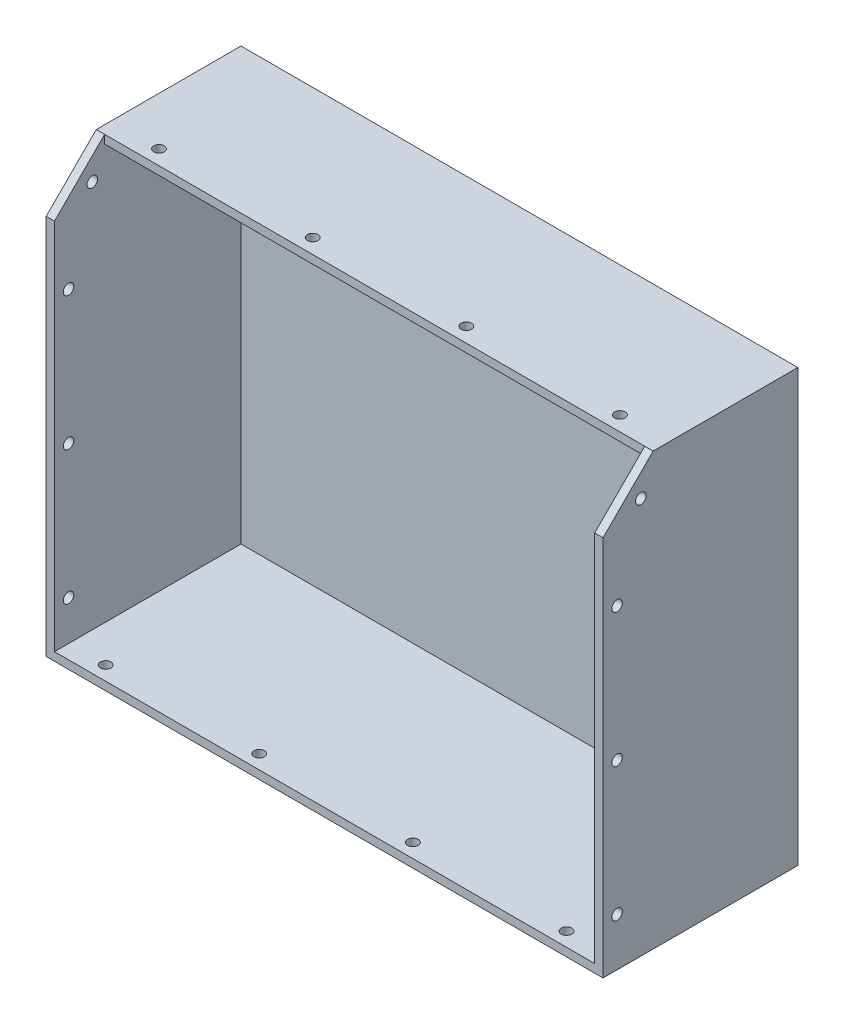
ISO-10303-21;
HEADER;
FILE_DESCRIPTION(('STEP AP214'),'2;1');
FILE_NAME('part.step','',(''),(''),'','','');
FILE_SCHEMA(('AUTOMOTIVE_DESIGN { 1 0 10303 214 1 1 1 1 }'));
ENDSEC;
DATA;
#1=APPLICATION_CONTEXT('core data for automotive mechanical design processes');
#2=APPLICATION_PROTOCOL_DEFINITION('international standard','automotive_design',2000,#1);
#3=PRODUCT_CONTEXT('',#1,'mechanical');
#4=PRODUCT('Part','Part','',(#3));
#5=PRODUCT_RELATED_PRODUCT_CATEGORY('part','',(#4));
#6=PRODUCT_DEFINITION_FORMATION('','',#4);
#7=PRODUCT_DEFINITION_CONTEXT('part definition',#1,'design');
#8=PRODUCT_DEFINITION('design','',#6,#7);
#9=PRODUCT_DEFINITION_SHAPE('','',#8);
#10=(LENGTH_UNIT() NAMED_UNIT(*) SI_UNIT(.MILLI.,.METRE.));
#11=(NAMED_UNIT(*) PLANE_ANGLE_UNIT() SI_UNIT($,.RADIAN.));
#12=(NAMED_UNIT(*) SI_UNIT($,.STERADIAN.) SOLID_ANGLE_UNIT());
#13=UNCERTAINTY_MEASURE_WITH_UNIT(LENGTH_MEASURE(1.E-05),#10,'distance_accuracy_value','');
#14=(GEOMETRIC_REPRESENTATION_CONTEXT(3) GLOBAL_UNCERTAINTY_ASSIGNED_CONTEXT((#13)) GLOBAL_UNIT_ASSIGNED_CONTEXT((#10,
#11,#12)) REPRESENTATION_CONTEXT('',''));
#15=CARTESIAN_POINT('',(0.,0.,0.));
#16=DIRECTION('',(0.,0.,1.));
#17=DIRECTION('',(1.,0.,0.));
#18=AXIS2_PLACEMENT_3D('',#15,#16,#17);
#19=CARTESIAN_POINT('',(87.6723333333333,-82.001,49.4453333333334));
#20=DIRECTION('',(0.,1.,0.));
#21=DIRECTION('',(0.,0.,1.));
#22=AXIS2_PLACEMENT_3D('',#19,#20,#21);
#23=CYLINDRICAL_SURFACE('',#22,2.);
#24=CARTESIAN_POINT('',(87.6723333333333,78.825,49.4453333333334));
#25=DIRECTION('',(0.,-1.,0.));
#26=DIRECTION('',(0.,0.,-1.));
#27=AXIS2_PLACEMENT_3D('',#24,#25,#26);
#28=CIRCLE('',#27,2.);
#29=CARTESIAN_POINT('',(87.6723333333333,78.825,47.4453333333334));
#30=VERTEX_POINT('',#29);
#31=EDGE_CURVE('E51',#30,#30,#28,.F.);
#32=ORIENTED_EDGE('',*,*,#31,.F.);
#33=EDGE_LOOP('',(#32));
#34=FACE_BOUND('',#33,.T.);
#35=CARTESIAN_POINT('',(87.6723333333333,82.,49.4453333333334));
#36=DIRECTION('',(0.,1.,0.));
#37=DIRECTION('',(0.,0.,1.));
#38=AXIS2_PLACEMENT_3D('',#35,#36,#37);
#39=CIRCLE('',#38,2.);
#40=CARTESIAN_POINT('',(87.6723333333333,82.,51.4453333333334));
#41=VERTEX_POINT('',#40);
#42=EDGE_CURVE('E11',#41,#41,#39,.T.);
#43=ORIENTED_EDGE('',*,*,#42,.T.);
#44=EDGE_LOOP('',(#43));
#45=FACE_BOUND('',#44,.T.);
#46=ADVANCED_FACE('F42',(#34,#45),#23,.F.);
#47=CARTESIAN_POINT('',(29.2523333333333,-82.001,49.4453333333334));
#48=DIRECTION('',(0.,1.,0.));
#49=DIRECTION('',(0.,0.,1.));
#50=AXIS2_PLACEMENT_3D('',#47,#48,#49);
#51=CYLINDRICAL_SURFACE('',#50,2.);
#52=CARTESIAN_POINT('',(29.2523333333333,78.825,49.4453333333334));
#53=DIRECTION('',(0.,-1.,0.));
#54=DIRECTION('',(0.,0.,-1.));
#55=AXIS2_PLACEMENT_3D('',#52,#53,#54);
#56=CIRCLE('',#55,2.);
#57=CARTESIAN_POINT('',(29.2523333333333,78.825,47.4453333333334));
#58=VERTEX_POINT('',#57);
#59=EDGE_CURVE('E174',#58,#58,#56,.F.);
#60=ORIENTED_EDGE('',*,*,#59,.F.);
#61=EDGE_LOOP('',(#60));
#62=FACE_BOUND('',#61,.T.);
#63=CARTESIAN_POINT('',(29.2523333333333,82.,49.4453333333334));
#64=DIRECTION('',(0.,1.,0.));
#65=DIRECTION('',(0.,0.,1.));
#66=AXIS2_PLACEMENT_3D('',#63,#64,#65);
#67=CIRCLE('',#66,2.);
#68=CARTESIAN_POINT('',(29.2523333333333,82.,51.4453333333334));
#69=VERTEX_POINT('',#68);
#70=EDGE_CURVE('E178',#69,#69,#67,.T.);
#71=ORIENTED_EDGE('',*,*,#70,.T.);
#72=EDGE_LOOP('',(#71));
#73=FACE_BOUND('',#72,.T.);
#74=ADVANCED_FACE('F190',(#62,#73),#51,.F.);
#75=CARTESIAN_POINT('',(86.6563333333333,82.001,68.7493333333333));
#76=DIRECTION('',(0.,-1.,0.));
#77=DIRECTION('',(0.,0.,-1.));
#78=AXIS2_PLACEMENT_3D('',#75,#76,#77);
#79=CYLINDRICAL_SURFACE('',#78,2.);
#80=CARTESIAN_POINT('',(86.6563333333333,-78.825,68.7493333333333));
#81=DIRECTION('',(0.,1.,0.));
#82=DIRECTION('',(0.,0.,1.));
#83=AXIS2_PLACEMENT_3D('',#80,#81,#82);
#84=CIRCLE('',#83,2.);
#85=CARTESIAN_POINT('',(86.6563333333333,-78.825,70.7493333333333));
#86=VERTEX_POINT('',#85);
#87=EDGE_CURVE('E166',#86,#86,#84,.F.);
#88=ORIENTED_EDGE('',*,*,#87,.F.);
#89=EDGE_LOOP('',(#88));
#90=FACE_BOUND('',#89,.T.);
#91=CARTESIAN_POINT('',(86.6563333333333,-82.,68.7493333333333));
#92=DIRECTION('',(0.,-1.,0.));
#93=DIRECTION('',(0.,0.,-1.));
#94=AXIS2_PLACEMENT_3D('',#91,#92,#93);
#95=CIRCLE('',#94,2.);
#96=CARTESIAN_POINT('',(86.6563333333333,-82.,66.7493333333333));
#97=VERTEX_POINT('',#96);
#98=EDGE_CURVE('E170',#97,#97,#95,.T.);
#99=ORIENTED_EDGE('',*,*,#98,.T.);
#100=EDGE_LOOP('',(#99));
#101=FACE_BOUND('',#100,.T.);
#102=ADVANCED_FACE('F223',(#90,#101),#79,.F.);
#103=CARTESIAN_POINT('',(28.2363333333333,82.001,68.7493333333333));
#104=DIRECTION('',(0.,-1.,0.));
#105=DIRECTION('',(0.,0.,-1.));
#106=AXIS2_PLACEMENT_3D('',#103,#104,#105);
#107=CYLINDRICAL_SURFACE('',#106,2.);
#108=CARTESIAN_POINT('',(28.2363333333333,-78.825,68.7493333333333));
#109=DIRECTION('',(0.,1.,0.));
#110=DIRECTION('',(0.,0.,1.));
#111=AXIS2_PLACEMENT_3D('',#108,#109,#110);
#112=CIRCLE('',#111,2.);
#113=CARTESIAN_POINT('',(28.2363333333333,-78.825,70.7493333333333));
#114=VERTEX_POINT('',#113);
#115=EDGE_CURVE('E158',#114,#114,#112,.F.);
#116=ORIENTED_EDGE('',*,*,#115,.F.);
#117=EDGE_LOOP('',(#116));
#118=FACE_BOUND('',#117,.T.);
#119=CARTESIAN_POINT('',(28.2363333333333,-82.,68.7493333333333));
#120=DIRECTION('',(0.,-1.,0.));
#121=DIRECTION('',(0.,0.,-1.));
#122=AXIS2_PLACEMENT_3D('',#119,#120,#121);
#123=CIRCLE('',#122,2.);
#124=CARTESIAN_POINT('',(28.2363333333333,-82.,66.7493333333333));
#125=VERTEX_POINT('',#124);
#126=EDGE_CURVE('E162',#125,#125,#123,.T.);
#127=ORIENTED_EDGE('',*,*,#126,.T.);
#128=EDGE_LOOP('',(#127));
#129=FACE_BOUND('',#128,.T.);
#130=ADVANCED_FACE('F219',(#118,#129),#107,.F.);
#131=CARTESIAN_POINT('',(105.875666666667,37.888,68.7493333333333));
#132=DIRECTION('',(-1.,0.,0.));
#133=DIRECTION('',(0.,0.,1.));
#134=AXIS2_PLACEMENT_3D('',#131,#132,#133);
#135=CYLINDRICAL_SURFACE('',#134,2.);
#136=CARTESIAN_POINT('',(-102.700666666667,37.888,68.7493333333333));
#137=DIRECTION('',(1.,0.,0.));
#138=DIRECTION('',(0.,0.,-1.));
#139=AXIS2_PLACEMENT_3D('',#136,#137,#138);
#140=CIRCLE('',#139,2.);
#141=CARTESIAN_POINT('',(-102.700666666667,37.888,66.7493333333333));
#142=VERTEX_POINT('',#141);
#143=EDGE_CURVE('E150',#142,#142,#140,.T.);
#144=ORIENTED_EDGE('',*,*,#143,.T.);
#145=EDGE_LOOP('',(#144));
#146=FACE_BOUND('',#145,.T.);
#147=CARTESIAN_POINT('',(-105.875666666667,37.888,68.7493333333333));
#148=DIRECTION('',(-1.,0.,0.));
#149=DIRECTION('',(0.,0.,1.));
#150=AXIS2_PLACEMENT_3D('',#147,#148,#149);
#151=CIRCLE('',#150,2.);
#152=CARTESIAN_POINT('',(-105.875666666667,37.888,70.7493333333333));
#153=VERTEX_POINT('',#152);
#154=EDGE_CURVE('E154',#153,#153,#151,.T.);
#155=ORIENTED_EDGE('',*,*,#154,.T.);
#156=EDGE_LOOP('',(#155));
#157=FACE_BOUND('',#156,.T.);
#158=ADVANCED_FACE('F205',(#146,#157),#135,.F.);
#159=CARTESIAN_POINT('',(105.875666666667,37.888,68.7493333333333));
#160=DIRECTION('',(-1.,0.,0.));
#161=DIRECTION('',(0.,0.,1.));
#162=AXIS2_PLACEMENT_3D('',#159,#160,#161);
#163=CYLINDRICAL_SURFACE('',#162,2.);
#164=CARTESIAN_POINT('',(105.875666666667,37.888,68.7493333333333));
#165=DIRECTION('',(-1.,0.,0.));
#166=DIRECTION('',(0.,0.,1.));
#167=AXIS2_PLACEMENT_3D('',#164,#165,#166);
#168=CIRCLE('',#167,2.);
#169=CARTESIAN_POINT('',(105.875666666667,37.888,70.7493333333333));
#170=VERTEX_POINT('',#169);
#171=EDGE_CURVE('E136',#170,#170,#168,.T.);
#172=ORIENTED_EDGE('',*,*,#171,.F.);
#173=EDGE_LOOP('',(#172));
#174=FACE_BOUND('',#173,.T.);
#175=CARTESIAN_POINT('',(102.700666666667,37.888,68.7493333333333));
#176=DIRECTION('',(1.,0.,0.));
#177=DIRECTION('',(0.,0.,-1.));
#178=AXIS2_PLACEMENT_3D('',#175,#176,#177);
#179=CIRCLE('',#178,2.);
#180=CARTESIAN_POINT('',(102.700666666667,37.888,66.7493333333333));
#181=VERTEX_POINT('',#180);
#182=EDGE_CURVE('E146',#181,#181,#179,.T.);
#183=ORIENTED_EDGE('',*,*,#182,.F.);
#184=EDGE_LOOP('',(#183));
#185=FACE_BOUND('',#184,.T.);
#186=ADVANCED_FACE('F196',(#174,#185),#163,.F.);
#187=CARTESIAN_POINT('',(-105.875666666667,82.,74.0833333333333));
#188=DIRECTION('',(0.,-1.,0.));
#189=DIRECTION('',(0.,0.,-1.));
#190=AXIS2_PLACEMENT_3D('',#187,#188,#189);
#191=PLANE('',#190);
#192=CARTESIAN_POINT('',(-29.1676666666667,82.,49.4453333333333));
#193=DIRECTION('',(0.,1.,0.));
#194=DIRECTION('',(0.,0.,1.));
#195=AXIS2_PLACEMENT_3D('',#192,#193,#194);
#196=CIRCLE('',#195,2.);
#197=CARTESIAN_POINT('',(-29.1676666666667,82.,51.4453333333333));
#198=VERTEX_POINT('',#197);
#199=EDGE_CURVE('E530',#198,#198,#196,.T.);
#200=ORIENTED_EDGE('',*,*,#199,.F.);
#201=EDGE_LOOP('',(#200));
#202=FACE_BOUND('',#201,.T.);
#203=CARTESIAN_POINT('',(-87.5876666666667,82.,49.4453333333333));
#204=DIRECTION('',(0.,1.,0.));
#205=DIRECTION('',(0.,0.,1.));
#206=AXIS2_PLACEMENT_3D('',#203,#204,#205);
#207=CIRCLE('',#206,2.);
#208=CARTESIAN_POINT('',(-87.5876666666667,82.,51.4453333333333));
#209=VERTEX_POINT('',#208);
#210=EDGE_CURVE('E538',#209,#209,#207,.T.);
#211=ORIENTED_EDGE('',*,*,#210,.F.);
#212=EDGE_LOOP('',(#211));
#213=FACE_BOUND('',#212,.T.);
#214=DIRECTION('',(-1.,0.,0.));
#215=VECTOR('',#214,1.);
#216=CARTESIAN_POINT('',(457.207176090762,82.,55.0333333333333));
#217=LINE('',#216,#215);
#218=CARTESIAN_POINT('',(105.875666666667,82.,55.0333333333333));
#219=VERTEX_POINT('',#218);
#220=CARTESIAN_POINT('',(102.700666666667,82.,55.0333333333333));
#221=VERTEX_POINT('',#220);
#222=EDGE_CURVE('E299',#219,#221,#217,.T.);
#223=ORIENTED_EDGE('',*,*,#222,.F.);
#224=DIRECTION('',(0.,0.,-1.));
#225=VECTOR('',#224,1.);
#226=CARTESIAN_POINT('',(105.875666666667,82.,74.0833333333333));
#227=LINE('',#226,#225);
#228=CARTESIAN_POINT('',(105.875666666667,82.,0.));
#229=VERTEX_POINT('',#228);
#230=EDGE_CURVE('E133',#219,#229,#227,.T.);
#231=ORIENTED_EDGE('',*,*,#230,.T.);
#232=DIRECTION('',(-1.,0.,0.));
#233=VECTOR('',#232,1.);
#234=CARTESIAN_POINT('',(-105.875666666667,82.,0.));
#235=LINE('',#234,#233);
#236=CARTESIAN_POINT('',(-105.875666666667,82.,0.));
#237=VERTEX_POINT('',#236);
#238=EDGE_CURVE('E113',#229,#237,#235,.T.);
#239=ORIENTED_EDGE('',*,*,#238,.T.);
#240=DIRECTION('',(0.,0.,-1.));
#241=VECTOR('',#240,1.);
#242=CARTESIAN_POINT('',(-105.875666666667,82.,74.0833333333333));
#243=LINE('',#242,#241);
#244=CARTESIAN_POINT('',(-105.875666666667,82.,55.0333333333333));
#245=VERTEX_POINT('',#244);
#246=EDGE_CURVE('E130',#245,#237,#243,.T.);
#247=ORIENTED_EDGE('',*,*,#246,.F.);
#248=DIRECTION('',(-1.,0.,0.));
#249=VECTOR('',#248,1.);
#250=CARTESIAN_POINT('',(-102.700666666667,82.,55.0333333333333));
#251=LINE('',#250,#249);
#252=CARTESIAN_POINT('',(-102.700666666667,82.,55.0333333333333));
#253=VERTEX_POINT('',#252);
#254=EDGE_CURVE('E319',#253,#245,#251,.T.);
#255=ORIENTED_EDGE('',*,*,#254,.F.);
#256=DIRECTION('',(-1.,0.,0.));
#257=VECTOR('',#256,1.);
#258=CARTESIAN_POINT('',(-102.700666666667,82.,55.0333333333333));
#259=LINE('',#258,#257);
#260=EDGE_CURVE('E315',#221,#253,#259,.T.);
#261=ORIENTED_EDGE('',*,*,#260,.F.);
#262=EDGE_LOOP('',(#223,#231,#239,#247,#255,#261));
#263=FACE_BOUND('',#262,.T.);
#264=ORIENTED_EDGE('',*,*,#70,.F.);
#265=EDGE_LOOP('',(#264));
#266=FACE_BOUND('',#265,.T.);
#267=ORIENTED_EDGE('',*,*,#42,.F.);
#268=EDGE_LOOP('',(#267));
#269=FACE_BOUND('',#268,.T.);
#270=ADVANCED_FACE('F193',(#202,#213,#263,#266,#269),#191,.F.);
#271=CARTESIAN_POINT('',(102.700666666667,0.,3.17500000333333));
#272=DIRECTION('',(1.,0.,0.));
#273=DIRECTION('',(0.,0.,-1.));
#274=AXIS2_PLACEMENT_3D('',#271,#272,#273);
#275=PLANE('',#274);
#276=CARTESIAN_POINT('',(102.700666666667,68.7092209408177,59.7030665162892));
#277=DIRECTION('',(1.,0.,0.));
#278=DIRECTION('',(0.,0.,-1.));
#279=AXIS2_PLACEMENT_3D('',#276,#277,#278);
#280=CIRCLE('',#279,1.99999999999998);
#281=CARTESIAN_POINT('',(102.700666666667,68.7092209408177,57.7030665162893));
#282=VERTEX_POINT('',#281);
#283=EDGE_CURVE('E523',#282,#282,#280,.T.);
#284=ORIENTED_EDGE('',*,*,#283,.T.);
#285=EDGE_LOOP('',(#284));
#286=FACE_BOUND('',#285,.T.);
#287=CARTESIAN_POINT('',(102.700666666667,-12.912,68.7493333333333));
#288=DIRECTION('',(1.,0.,0.));
#289=DIRECTION('',(0.,0.,-1.));
#290=AXIS2_PLACEMENT_3D('',#287,#288,#289);
#291=CIRCLE('',#290,2.);
#292=CARTESIAN_POINT('',(102.700666666667,-12.912,66.7493333333333));
#293=VERTEX_POINT('',#292);
#294=EDGE_CURVE('E285',#293,#293,#291,.T.);
#295=ORIENTED_EDGE('',*,*,#294,.T.);
#296=EDGE_LOOP('',(#295));
#297=FACE_BOUND('',#296,.T.);
#298=CARTESIAN_POINT('',(102.700666666667,-63.712,68.7493333333333));
#299=DIRECTION('',(1.,0.,0.));
#300=DIRECTION('',(0.,0.,-1.));
#301=AXIS2_PLACEMENT_3D('',#298,#299,#300);
#302=CIRCLE('',#301,2.);
#303=CARTESIAN_POINT('',(102.700666666667,-63.712,66.7493333333333));
#304=VERTEX_POINT('',#303);
#305=EDGE_CURVE('E141',#304,#304,#302,.T.);
#306=ORIENTED_EDGE('',*,*,#305,.T.);
#307=EDGE_LOOP('',(#306));
#308=FACE_BOUND('',#307,.T.);
#309=DIRECTION('',(0.,-0.707106781186547,0.707106781186548));
#310=VECTOR('',#309,1.);
#311=CARTESIAN_POINT('',(102.700666666667,68.5166666666667,68.5166666666667));
#312=LINE('',#311,#310);
#313=CARTESIAN_POINT('',(102.700666666667,62.95,74.0833333333333));
#314=VERTEX_POINT('',#313);
#315=EDGE_CURVE('E332',#221,#314,#312,.T.);
#316=ORIENTED_EDGE('',*,*,#315,.F.);
#317=DIRECTION('',(0.,1.,0.));
#318=VECTOR('',#317,1.);
#319=CARTESIAN_POINT('',(102.700666666667,82.,55.0333333333333));
#320=LINE('',#319,#318);
#321=CARTESIAN_POINT('',(102.700666666667,78.825,55.0333333333333));
#322=VERTEX_POINT('',#321);
#323=EDGE_CURVE('E311',#322,#221,#320,.T.);
#324=ORIENTED_EDGE('',*,*,#323,.F.);
#325=DIRECTION('',(0.,0.,1.));
#326=VECTOR('',#325,1.);
#327=CARTESIAN_POINT('',(102.700666666667,78.825,3.17500000333333));
#328=LINE('',#327,#326);
#329=CARTESIAN_POINT('',(102.700666666667,78.825,3.17500000333333));
#330=VERTEX_POINT('',#329);
#331=EDGE_CURVE('E115',#330,#322,#328,.T.);
#332=ORIENTED_EDGE('',*,*,#331,.F.);
#333=DIRECTION('',(0.,1.,0.));
#334=VECTOR('',#333,1.);
#335=CARTESIAN_POINT('',(102.700666666667,0.,3.17500000333333));
#336=LINE('',#335,#334);
#337=CARTESIAN_POINT('',(102.700666666667,-78.825,3.17500000333333));
#338=VERTEX_POINT('',#337);
#339=EDGE_CURVE('E354',#338,#330,#336,.T.);
#340=ORIENTED_EDGE('',*,*,#339,.F.);
#341=DIRECTION('',(0.,0.,1.));
#342=VECTOR('',#341,1.);
#343=CARTESIAN_POINT('',(102.700666666667,-78.825,3.17500000333333));
#344=LINE('',#343,#342);
#345=CARTESIAN_POINT('',(102.700666666667,-78.825,74.0833333333333));
#346=VERTEX_POINT('',#345);
#347=EDGE_CURVE('E121',#338,#346,#344,.T.);
#348=ORIENTED_EDGE('',*,*,#347,.T.);
#349=DIRECTION('',(0.,1.,0.));
#350=VECTOR('',#349,1.);
#351=CARTESIAN_POINT('',(102.700666666667,0.,74.0833333333333));
#352=LINE('',#351,#350);
#353=EDGE_CURVE('E346',#346,#314,#352,.T.);
#354=ORIENTED_EDGE('',*,*,#353,.T.);
#355=EDGE_LOOP('',(#316,#324,#332,#340,#348,#354));
#356=FACE_BOUND('',#355,.T.);
#357=ORIENTED_EDGE('',*,*,#182,.T.);
#358=EDGE_LOOP('',(#357));
#359=FACE_BOUND('',#358,.T.);
#360=ADVANCED_FACE('F195',(#286,#297,#308,#356,#359),#275,.F.);
#361=CARTESIAN_POINT('',(0.,78.825,3.17500000333333));
#362=DIRECTION('',(0.,-1.,0.));
#363=DIRECTION('',(0.,0.,-1.));
#364=AXIS2_PLACEMENT_3D('',#361,#362,#363);
#365=PLANE('',#364);
#366=CARTESIAN_POINT('',(-29.1676666666667,78.825,49.4453333333333));
#367=DIRECTION('',(0.,-1.,0.));
#368=DIRECTION('',(0.,0.,-1.));
#369=AXIS2_PLACEMENT_3D('',#366,#367,#368);
#370=CIRCLE('',#369,2.);
#371=CARTESIAN_POINT('',(-29.1676666666667,78.825,47.4453333333334));
#372=VERTEX_POINT('',#371);
#373=EDGE_CURVE('E527',#372,#372,#370,.F.);
#374=ORIENTED_EDGE('',*,*,#373,.T.);
#375=EDGE_LOOP('',(#374));
#376=FACE_BOUND('',#375,.T.);
#377=CARTESIAN_POINT('',(-87.5876666666667,78.825,49.4453333333333));
#378=DIRECTION('',(0.,-1.,0.));
#379=DIRECTION('',(0.,0.,-1.));
#380=AXIS2_PLACEMENT_3D('',#377,#378,#379);
#381=CIRCLE('',#380,2.);
#382=CARTESIAN_POINT('',(-87.5876666666667,78.825,47.4453333333333));
#383=VERTEX_POINT('',#382);
#384=EDGE_CURVE('E534',#383,#383,#381,.F.);
#385=ORIENTED_EDGE('',*,*,#384,.T.);
#386=EDGE_LOOP('',(#385));
#387=FACE_BOUND('',#386,.T.);
#388=ORIENTED_EDGE('',*,*,#331,.T.);
#389=DIRECTION('',(1.,0.,0.));
#390=VECTOR('',#389,1.);
#391=CARTESIAN_POINT('',(-102.700666666667,78.825,55.0333333333333));
#392=LINE('',#391,#390);
#393=CARTESIAN_POINT('',(-102.700666666667,78.825,55.0333333333333));
#394=VERTEX_POINT('',#393);
#395=EDGE_CURVE('E307',#394,#322,#392,.T.);
#396=ORIENTED_EDGE('',*,*,#395,.F.);
#397=DIRECTION('',(0.,0.,1.));
#398=VECTOR('',#397,1.);
#399=CARTESIAN_POINT('',(-102.700666666667,78.825,3.17500000333333));
#400=LINE('',#399,#398);
#401=CARTESIAN_POINT('',(-102.700666666667,78.825,3.17500000333333));
#402=VERTEX_POINT('',#401);
#403=EDGE_CURVE('E358',#402,#394,#400,.T.);
#404=ORIENTED_EDGE('',*,*,#403,.F.);
#405=DIRECTION('',(1.,0.,0.));
#406=VECTOR('',#405,1.);
#407=CARTESIAN_POINT('',(0.,78.825,3.17500000333333));
#408=LINE('',#407,#406);
#409=EDGE_CURVE('E341',#402,#330,#408,.T.);
#410=ORIENTED_EDGE('',*,*,#409,.T.);
#411=EDGE_LOOP('',(#388,#396,#404,#410));
#412=FACE_BOUND('',#411,.T.);
#413=ORIENTED_EDGE('',*,*,#59,.T.);
#414=EDGE_LOOP('',(#413));
#415=FACE_BOUND('',#414,.T.);
#416=ORIENTED_EDGE('',*,*,#31,.T.);
#417=EDGE_LOOP('',(#416));
#418=FACE_BOUND('',#417,.T.);
#419=ADVANCED_FACE('F186',(#376,#387,#412,#415,#418),#365,.T.);
#420=CARTESIAN_POINT('',(105.875666666667,-82.,74.0833333333333));
#421=DIRECTION('',(-1.,0.,0.));
#422=DIRECTION('',(0.,0.,1.));
#423=AXIS2_PLACEMENT_3D('',#420,#421,#422);
#424=PLANE('',#423);
#425=CARTESIAN_POINT('',(105.875666666667,68.7092209408177,59.7030665162892));
#426=DIRECTION('',(-1.,0.,0.));
#427=DIRECTION('',(0.,0.,1.));
#428=AXIS2_PLACEMENT_3D('',#425,#426,#427);
#429=CIRCLE('',#428,1.99999999999998);
#430=CARTESIAN_POINT('',(105.875666666667,68.7092209408177,61.7030665162892));
#431=VERTEX_POINT('',#430);
#432=EDGE_CURVE('E517',#431,#431,#429,.T.);
#433=ORIENTED_EDGE('',*,*,#432,.T.);
#434=EDGE_LOOP('',(#433));
#435=FACE_BOUND('',#434,.T.);
#436=CARTESIAN_POINT('',(105.875666666667,-12.912,68.7493333333333));
#437=DIRECTION('',(-1.,0.,0.));
#438=DIRECTION('',(0.,0.,1.));
#439=AXIS2_PLACEMENT_3D('',#436,#437,#438);
#440=CIRCLE('',#439,2.);
#441=CARTESIAN_POINT('',(105.875666666667,-12.912,70.7493333333333));
#442=VERTEX_POINT('',#441);
#443=EDGE_CURVE('E281',#442,#442,#440,.T.);
#444=ORIENTED_EDGE('',*,*,#443,.T.);
#445=EDGE_LOOP('',(#444));
#446=FACE_BOUND('',#445,.T.);
#447=CARTESIAN_POINT('',(105.875666666667,-63.712,68.7493333333333));
#448=DIRECTION('',(-1.,0.,0.));
#449=DIRECTION('',(0.,0.,1.));
#450=AXIS2_PLACEMENT_3D('',#447,#448,#449);
#451=CIRCLE('',#450,2.);
#452=CARTESIAN_POINT('',(105.875666666667,-63.712,70.7493333333333));
#453=VERTEX_POINT('',#452);
#454=EDGE_CURVE('E142',#453,#453,#451,.T.);
#455=ORIENTED_EDGE('',*,*,#454,.T.);
#456=EDGE_LOOP('',(#455));
#457=FACE_BOUND('',#456,.T.);
#458=ORIENTED_EDGE('',*,*,#230,.F.);
#459=DIRECTION('',(0.,0.707106781186547,-0.707106781186548));
#460=VECTOR('',#459,1.);
#461=CARTESIAN_POINT('',(105.875666666667,68.5166666666667,68.5166666666667));
#462=LINE('',#461,#460);
#463=CARTESIAN_POINT('',(105.875666666667,62.95,74.0833333333333));
#464=VERTEX_POINT('',#463);
#465=EDGE_CURVE('E336',#464,#219,#462,.T.);
#466=ORIENTED_EDGE('',*,*,#465,.F.);
#467=DIRECTION('',(0.,1.,0.));
#468=VECTOR('',#467,1.);
#469=CARTESIAN_POINT('',(105.875666666667,-82.,74.0833333333333));
#470=LINE('',#469,#468);
#471=CARTESIAN_POINT('',(105.875666666667,-82.,74.0833333333333));
#472=VERTEX_POINT('',#471);
#473=EDGE_CURVE('E98',#472,#464,#470,.T.);
#474=ORIENTED_EDGE('',*,*,#473,.F.);
#475=DIRECTION('',(0.,0.,-1.));
#476=VECTOR('',#475,1.);
#477=CARTESIAN_POINT('',(105.875666666667,-82.,74.0833333333333));
#478=LINE('',#477,#476);
#479=CARTESIAN_POINT('',(105.875666666667,-82.,0.));
#480=VERTEX_POINT('',#479);
#481=EDGE_CURVE('E90',#472,#480,#478,.T.);
#482=ORIENTED_EDGE('',*,*,#481,.T.);
#483=DIRECTION('',(0.,1.,0.));
#484=VECTOR('',#483,1.);
#485=CARTESIAN_POINT('',(105.875666666667,-82.,0.));
#486=LINE('',#485,#484);
#487=EDGE_CURVE('E106',#480,#229,#486,.T.);
#488=ORIENTED_EDGE('',*,*,#487,.T.);
#489=EDGE_LOOP('',(#458,#466,#474,#482,#488));
#490=FACE_BOUND('',#489,.T.);
#491=ORIENTED_EDGE('',*,*,#171,.T.);
#492=EDGE_LOOP('',(#491));
#493=FACE_BOUND('',#492,.T.);
#494=ADVANCED_FACE('F104',(#435,#446,#457,#490,#493),#424,.F.);
#495=CARTESIAN_POINT('',(-105.875666666667,-82.,74.0833333333333));
#496=DIRECTION('',(1.,0.,0.));
#497=DIRECTION('',(0.,0.,-1.));
#498=AXIS2_PLACEMENT_3D('',#495,#496,#497);
#499=PLANE('',#498);
#500=CARTESIAN_POINT('',(-105.875666666667,68.7092209408177,59.7030665162892));
#501=DIRECTION('',(-1.,0.,0.));
#502=DIRECTION('',(0.,0.,1.));
#503=AXIS2_PLACEMENT_3D('',#500,#501,#502);
#504=CIRCLE('',#503,1.99999999999998);
#505=CARTESIAN_POINT('',(-105.875666666667,68.7092209408177,61.7030665162892));
#506=VERTEX_POINT('',#505);
#507=EDGE_CURVE('E512',#506,#506,#504,.T.);
#508=ORIENTED_EDGE('',*,*,#507,.F.);
#509=EDGE_LOOP('',(#508));
#510=FACE_BOUND('',#509,.T.);
#511=CARTESIAN_POINT('',(-105.875666666667,-12.912,68.7493333333333));
#512=DIRECTION('',(-1.,0.,0.));
#513=DIRECTION('',(0.,0.,1.));
#514=AXIS2_PLACEMENT_3D('',#511,#512,#513);
#515=CIRCLE('',#514,2.);
#516=CARTESIAN_POINT('',(-105.875666666667,-12.912,70.7493333333333));
#517=VERTEX_POINT('',#516);
#518=EDGE_CURVE('E271',#517,#517,#515,.T.);
#519=ORIENTED_EDGE('',*,*,#518,.F.);
#520=EDGE_LOOP('',(#519));
#521=FACE_BOUND('',#520,.T.);
#522=CARTESIAN_POINT('',(-105.875666666667,-63.712,68.7493333333333));
#523=DIRECTION('',(-1.,0.,0.));
#524=DIRECTION('',(0.,0.,1.));
#525=AXIS2_PLACEMENT_3D('',#522,#523,#524);
#526=CIRCLE('',#525,2.);
#527=CARTESIAN_POINT('',(-105.875666666667,-63.712,70.7493333333333));
#528=VERTEX_POINT('',#527);
#529=EDGE_CURVE('E289',#528,#528,#526,.T.);
#530=ORIENTED_EDGE('',*,*,#529,.F.);
#531=EDGE_LOOP('',(#530));
#532=FACE_BOUND('',#531,.T.);
#533=DIRECTION('',(0.,-0.707106781186547,0.707106781186548));
#534=VECTOR('',#533,1.);
#535=CARTESIAN_POINT('',(-105.875666666667,68.5166666666667,68.5166666666667));
#536=LINE('',#535,#534);
#537=CARTESIAN_POINT('',(-105.875666666667,62.95,74.0833333333333));
#538=VERTEX_POINT('',#537);
#539=EDGE_CURVE('E323',#245,#538,#536,.T.);
#540=ORIENTED_EDGE('',*,*,#539,.F.);
#541=ORIENTED_EDGE('',*,*,#246,.T.);
#542=DIRECTION('',(0.,-1.,0.));
#543=VECTOR('',#542,1.);
#544=CARTESIAN_POINT('',(-105.875666666667,-82.,0.));
#545=LINE('',#544,#543);
#546=CARTESIAN_POINT('',(-105.875666666667,-82.,0.));
#547=VERTEX_POINT('',#546);
#548=EDGE_CURVE('E99',#237,#547,#545,.T.);
#549=ORIENTED_EDGE('',*,*,#548,.T.);
#550=DIRECTION('',(0.,0.,-1.));
#551=VECTOR('',#550,1.);
#552=CARTESIAN_POINT('',(-105.875666666667,-82.,74.0833333333333));
#553=LINE('',#552,#551);
#554=CARTESIAN_POINT('',(-105.875666666667,-82.,74.0833333333333));
#555=VERTEX_POINT('',#554);
#556=EDGE_CURVE('E93',#555,#547,#553,.T.);
#557=ORIENTED_EDGE('',*,*,#556,.F.);
#558=DIRECTION('',(0.,-1.,0.));
#559=VECTOR('',#558,1.);
#560=CARTESIAN_POINT('',(-105.875666666667,-82.,74.0833333333333));
#561=LINE('',#560,#559);
#562=EDGE_CURVE('E380',#538,#555,#561,.T.);
#563=ORIENTED_EDGE('',*,*,#562,.F.);
#564=EDGE_LOOP('',(#540,#541,#549,#557,#563));
#565=FACE_BOUND('',#564,.T.);
#566=ORIENTED_EDGE('',*,*,#154,.F.);
#567=EDGE_LOOP('',(#566));
#568=FACE_BOUND('',#567,.T.);
#569=ADVANCED_FACE('F212',(#510,#521,#532,#565,#568),#499,.F.);
#570=CARTESIAN_POINT('',(0.,0.,74.0833333333333));
#571=DIRECTION('',(0.,0.,-1.));
#572=DIRECTION('',(-1.,0.,0.));
#573=AXIS2_PLACEMENT_3D('',#570,#571,#572);
#574=PLANE('',#573);
#575=ORIENTED_EDGE('',*,*,#473,.T.);
#576=DIRECTION('',(-1.,0.,0.));
#577=VECTOR('',#576,1.);
#578=CARTESIAN_POINT('',(105.876666666667,62.95,74.0833333333333));
#579=LINE('',#578,#577);
#580=EDGE_CURVE('E328',#464,#314,#579,.T.);
#581=ORIENTED_EDGE('',*,*,#580,.T.);
#582=ORIENTED_EDGE('',*,*,#353,.F.);
#583=DIRECTION('',(-1.,0.,0.));
#584=VECTOR('',#583,1.);
#585=CARTESIAN_POINT('',(0.,-78.825,74.0833333333333));
#586=LINE('',#585,#584);
#587=CARTESIAN_POINT('',(-102.700666666667,-78.825,74.0833333333333));
#588=VERTEX_POINT('',#587);
#589=EDGE_CURVE('E362',#346,#588,#586,.T.);
#590=ORIENTED_EDGE('',*,*,#589,.T.);
#591=DIRECTION('',(0.,1.,0.));
#592=VECTOR('',#591,1.);
#593=CARTESIAN_POINT('',(-102.700666666667,0.,74.0833333333333));
#594=LINE('',#593,#592);
#595=CARTESIAN_POINT('',(-102.700666666667,62.95,74.0833333333333));
#596=VERTEX_POINT('',#595);
#597=EDGE_CURVE('E340',#588,#596,#594,.T.);
#598=ORIENTED_EDGE('',*,*,#597,.T.);
#599=EDGE_CURVE('E58',#596,#538,#579,.T.);
#600=ORIENTED_EDGE('',*,*,#599,.T.);
#601=ORIENTED_EDGE('',*,*,#562,.T.);
#602=DIRECTION('',(1.,0.,0.));
#603=VECTOR('',#602,1.);
#604=CARTESIAN_POINT('',(-105.875666666667,-82.,74.0833333333333));
#605=LINE('',#604,#603);
#606=EDGE_CURVE('E67',#555,#472,#605,.T.);
#607=ORIENTED_EDGE('',*,*,#606,.T.);
#608=EDGE_LOOP('',(#575,#581,#582,#590,#598,#600,#601,#607));
#609=FACE_BOUND('',#608,.T.);
#610=ADVANCED_FACE('F247',(#609),#574,.F.);
#611=CARTESIAN_POINT('',(-105.875666666667,-82.,74.0833333333333));
#612=DIRECTION('',(0.,1.,0.));
#613=DIRECTION('',(0.,0.,1.));
#614=AXIS2_PLACEMENT_3D('',#611,#612,#613);
#615=PLANE('',#614);
#616=CARTESIAN_POINT('',(-30.1836666666667,-82.,68.7493333333333));
#617=DIRECTION('',(0.,-1.,0.));
#618=DIRECTION('',(0.,0.,-1.));
#619=AXIS2_PLACEMENT_3D('',#616,#617,#618);
#620=CIRCLE('',#619,2.);
#621=CARTESIAN_POINT('',(-30.1836666666667,-82.,66.7493333333333));
#622=VERTEX_POINT('',#621);
#623=EDGE_CURVE('E259',#622,#622,#620,.T.);
#624=ORIENTED_EDGE('',*,*,#623,.F.);
#625=EDGE_LOOP('',(#624));
#626=FACE_BOUND('',#625,.T.);
#627=CARTESIAN_POINT('',(-88.6036666666667,-82.,68.7493333333333));
#628=DIRECTION('',(0.,-1.,0.));
#629=DIRECTION('',(0.,0.,-1.));
#630=AXIS2_PLACEMENT_3D('',#627,#628,#629);
#631=CIRCLE('',#630,2.);
#632=CARTESIAN_POINT('',(-88.6036666666667,-82.,66.7493333333333));
#633=VERTEX_POINT('',#632);
#634=EDGE_CURVE('E262',#633,#633,#631,.T.);
#635=ORIENTED_EDGE('',*,*,#634,.F.);
#636=EDGE_LOOP('',(#635));
#637=FACE_BOUND('',#636,.T.);
#638=DIRECTION('',(1.,0.,0.));
#639=VECTOR('',#638,1.);
#640=CARTESIAN_POINT('',(-105.875666666667,-82.,0.));
#641=LINE('',#640,#639);
#642=EDGE_CURVE('E86',#547,#480,#641,.T.);
#643=ORIENTED_EDGE('',*,*,#642,.T.);
#644=ORIENTED_EDGE('',*,*,#481,.F.);
#645=ORIENTED_EDGE('',*,*,#606,.F.);
#646=ORIENTED_EDGE('',*,*,#556,.T.);
#647=EDGE_LOOP('',(#643,#644,#645,#646));
#648=FACE_BOUND('',#647,.T.);
#649=ORIENTED_EDGE('',*,*,#126,.F.);
#650=EDGE_LOOP('',(#649));
#651=FACE_BOUND('',#650,.T.);
#652=ORIENTED_EDGE('',*,*,#98,.F.);
#653=EDGE_LOOP('',(#652));
#654=FACE_BOUND('',#653,.T.);
#655=ADVANCED_FACE('F88',(#626,#637,#648,#651,#654),#615,.F.);
#656=CARTESIAN_POINT('',(0.,0.,0.));
#657=DIRECTION('',(0.,0.,-1.));
#658=DIRECTION('',(-1.,0.,0.));
#659=AXIS2_PLACEMENT_3D('',#656,#657,#658);
#660=PLANE('',#659);
#661=ORIENTED_EDGE('',*,*,#487,.F.);
#662=ORIENTED_EDGE('',*,*,#642,.F.);
#663=ORIENTED_EDGE('',*,*,#548,.F.);
#664=ORIENTED_EDGE('',*,*,#238,.F.);
#665=EDGE_LOOP('',(#661,#662,#663,#664));
#666=FACE_BOUND('',#665,.T.);
#667=ADVANCED_FACE('F111',(#666),#660,.T.);
#668=CARTESIAN_POINT('',(0.,-78.825,3.17500000333333));
#669=DIRECTION('',(0.,1.,0.));
#670=DIRECTION('',(0.,0.,1.));
#671=AXIS2_PLACEMENT_3D('',#668,#669,#670);
#672=PLANE('',#671);
#673=CARTESIAN_POINT('',(-30.1836666666667,-78.825,68.7493333333333));
#674=DIRECTION('',(0.,1.,0.));
#675=DIRECTION('',(0.,0.,1.));
#676=AXIS2_PLACEMENT_3D('',#673,#674,#675);
#677=CIRCLE('',#676,2.);
#678=CARTESIAN_POINT('',(-30.1836666666667,-78.825,70.7493333333333));
#679=VERTEX_POINT('',#678);
#680=EDGE_CURVE('E472',#679,#679,#677,.F.);
#681=ORIENTED_EDGE('',*,*,#680,.T.);
#682=EDGE_LOOP('',(#681));
#683=FACE_BOUND('',#682,.T.);
#684=CARTESIAN_POINT('',(-88.6036666666667,-78.825,68.7493333333333));
#685=DIRECTION('',(0.,1.,0.));
#686=DIRECTION('',(0.,0.,1.));
#687=AXIS2_PLACEMENT_3D('',#684,#685,#686);
#688=CIRCLE('',#687,2.);
#689=CARTESIAN_POINT('',(-88.6036666666667,-78.825,70.7493333333333));
#690=VERTEX_POINT('',#689);
#691=EDGE_CURVE('E266',#690,#690,#688,.F.);
#692=ORIENTED_EDGE('',*,*,#691,.T.);
#693=EDGE_LOOP('',(#692));
#694=FACE_BOUND('',#693,.T.);
#695=ORIENTED_EDGE('',*,*,#589,.F.);
#696=ORIENTED_EDGE('',*,*,#347,.F.);
#697=DIRECTION('',(-1.,0.,0.));
#698=VECTOR('',#697,1.);
#699=CARTESIAN_POINT('',(0.,-78.825,3.17500000333333));
#700=LINE('',#699,#698);
#701=CARTESIAN_POINT('',(-102.700666666667,-78.825,3.17500000333333));
#702=VERTEX_POINT('',#701);
#703=EDGE_CURVE('E350',#338,#702,#700,.T.);
#704=ORIENTED_EDGE('',*,*,#703,.T.);
#705=DIRECTION('',(0.,0.,1.));
#706=VECTOR('',#705,1.);
#707=CARTESIAN_POINT('',(-102.700666666667,-78.825,3.17500000333333));
#708=LINE('',#707,#706);
#709=EDGE_CURVE('E372',#702,#588,#708,.T.);
#710=ORIENTED_EDGE('',*,*,#709,.T.);
#711=EDGE_LOOP('',(#695,#696,#704,#710));
#712=FACE_BOUND('',#711,.T.);
#713=ORIENTED_EDGE('',*,*,#115,.T.);
#714=EDGE_LOOP('',(#713));
#715=FACE_BOUND('',#714,.T.);
#716=ORIENTED_EDGE('',*,*,#87,.T.);
#717=EDGE_LOOP('',(#716));
#718=FACE_BOUND('',#717,.T.);
#719=ADVANCED_FACE('F251',(#683,#694,#712,#715,#718),#672,.T.);
#720=CARTESIAN_POINT('',(-102.700666666667,0.,3.17500000333333));
#721=DIRECTION('',(1.,0.,0.));
#722=DIRECTION('',(0.,0.,-1.));
#723=AXIS2_PLACEMENT_3D('',#720,#721,#722);
#724=PLANE('',#723);
#725=CARTESIAN_POINT('',(-102.700666666667,68.7092209408177,59.7030665162892));
#726=DIRECTION('',(1.,0.,0.));
#727=DIRECTION('',(0.,0.,-1.));
#728=AXIS2_PLACEMENT_3D('',#725,#726,#727);
#729=CIRCLE('',#728,1.99999999999998);
#730=CARTESIAN_POINT('',(-102.700666666667,68.7092209408177,57.7030665162893));
#731=VERTEX_POINT('',#730);
#732=EDGE_CURVE('E45',#731,#731,#729,.T.);
#733=ORIENTED_EDGE('',*,*,#732,.F.);
#734=EDGE_LOOP('',(#733));
#735=FACE_BOUND('',#734,.T.);
#736=CARTESIAN_POINT('',(-102.700666666667,-12.912,68.7493333333333));
#737=DIRECTION('',(1.,0.,0.));
#738=DIRECTION('',(0.,0.,-1.));
#739=AXIS2_PLACEMENT_3D('',#736,#737,#738);
#740=CIRCLE('',#739,2.);
#741=CARTESIAN_POINT('',(-102.700666666667,-12.912,66.7493333333333));
#742=VERTEX_POINT('',#741);
#743=EDGE_CURVE('E265',#742,#742,#740,.T.);
#744=ORIENTED_EDGE('',*,*,#743,.F.);
#745=EDGE_LOOP('',(#744));
#746=FACE_BOUND('',#745,.T.);
#747=CARTESIAN_POINT('',(-102.700666666667,-63.712,68.7493333333333));
#748=DIRECTION('',(1.,0.,0.));
#749=DIRECTION('',(0.,0.,-1.));
#750=AXIS2_PLACEMENT_3D('',#747,#748,#749);
#751=CIRCLE('',#750,2.);
#752=CARTESIAN_POINT('',(-102.700666666667,-63.712,66.7493333333333));
#753=VERTEX_POINT('',#752);
#754=EDGE_CURVE('E137',#753,#753,#751,.T.);
#755=ORIENTED_EDGE('',*,*,#754,.F.);
#756=EDGE_LOOP('',(#755));
#757=FACE_BOUND('',#756,.T.);
#758=DIRECTION('',(0.,-0.707106781186547,0.707106781186548));
#759=VECTOR('',#758,1.);
#760=CARTESIAN_POINT('',(-102.700666666667,68.5166666666667,68.5166666666667));
#761=LINE('',#760,#759);
#762=EDGE_CURVE('E329',#253,#596,#761,.T.);
#763=ORIENTED_EDGE('',*,*,#762,.T.);
#764=ORIENTED_EDGE('',*,*,#597,.F.);
#765=ORIENTED_EDGE('',*,*,#709,.F.);
#766=DIRECTION('',(0.,1.,0.));
#767=VECTOR('',#766,1.);
#768=CARTESIAN_POINT('',(-102.700666666667,0.,3.17500000333333));
#769=LINE('',#768,#767);
#770=EDGE_CURVE('E345',#702,#402,#769,.T.);
#771=ORIENTED_EDGE('',*,*,#770,.T.);
#772=ORIENTED_EDGE('',*,*,#403,.T.);
#773=DIRECTION('',(0.,-1.,0.));
#774=VECTOR('',#773,1.);
#775=CARTESIAN_POINT('',(-102.700666666667,82.,55.0333333333333));
#776=LINE('',#775,#774);
#777=EDGE_CURVE('E303',#253,#394,#776,.T.);
#778=ORIENTED_EDGE('',*,*,#777,.F.);
#779=EDGE_LOOP('',(#763,#764,#765,#771,#772,#778));
#780=FACE_BOUND('',#779,.T.);
#781=ORIENTED_EDGE('',*,*,#143,.F.);
#782=EDGE_LOOP('',(#781));
#783=FACE_BOUND('',#782,.T.);
#784=ADVANCED_FACE('F245',(#735,#746,#757,#780,#783),#724,.T.);
#785=CARTESIAN_POINT('',(0.,0.,3.17500000333333));
#786=DIRECTION('',(0.,0.,1.));
#787=DIRECTION('',(1.,0.,0.));
#788=AXIS2_PLACEMENT_3D('',#785,#786,#787);
#789=PLANE('',#788);
#790=ORIENTED_EDGE('',*,*,#409,.F.);
#791=ORIENTED_EDGE('',*,*,#770,.F.);
#792=ORIENTED_EDGE('',*,*,#703,.F.);
#793=ORIENTED_EDGE('',*,*,#339,.T.);
#794=EDGE_LOOP('',(#790,#791,#792,#793));
#795=FACE_BOUND('',#794,.T.);
#796=ADVANCED_FACE('F448',(#795),#789,.T.);
#797=CARTESIAN_POINT('',(105.876666666667,68.5166666666667,68.5166666666667));
#798=DIRECTION('',(0.,-0.707106781186548,-0.707106781186547));
#799=DIRECTION('',(0.,0.707106781186547,-0.707106781186548));
#800=AXIS2_PLACEMENT_3D('',#797,#798,#799);
#801=PLANE('',#800);
#802=ORIENTED_EDGE('',*,*,#465,.T.);
#803=ORIENTED_EDGE('',*,*,#222,.T.);
#804=ORIENTED_EDGE('',*,*,#315,.T.);
#805=ORIENTED_EDGE('',*,*,#580,.F.);
#806=EDGE_LOOP('',(#802,#803,#804,#805));
#807=FACE_BOUND('',#806,.T.);
#808=ADVANCED_FACE('F438',(#807),#801,.F.);
#809=ORIENTED_EDGE('',*,*,#762,.F.);
#810=ORIENTED_EDGE('',*,*,#254,.T.);
#811=ORIENTED_EDGE('',*,*,#539,.T.);
#812=ORIENTED_EDGE('',*,*,#599,.F.);
#813=EDGE_LOOP('',(#809,#810,#811,#812));
#814=FACE_BOUND('',#813,.T.);
#815=ADVANCED_FACE('F451',(#814),#801,.F.);
#816=CARTESIAN_POINT('',(0.,0.,55.0333333333333));
#817=DIRECTION('',(0.,0.,1.));
#818=DIRECTION('',(1.,0.,0.));
#819=AXIS2_PLACEMENT_3D('',#816,#817,#818);
#820=PLANE('',#819);
#821=ORIENTED_EDGE('',*,*,#777,.T.);
#822=ORIENTED_EDGE('',*,*,#395,.T.);
#823=ORIENTED_EDGE('',*,*,#323,.T.);
#824=ORIENTED_EDGE('',*,*,#260,.T.);
#825=EDGE_LOOP('',(#821,#822,#823,#824));
#826=FACE_BOUND('',#825,.T.);
#827=ADVANCED_FACE('F441',(#826),#820,.T.);
#828=CARTESIAN_POINT('',(105.875666666667,-63.712,68.7493333333333));
#829=DIRECTION('',(-1.,0.,0.));
#830=DIRECTION('',(0.,0.,1.));
#831=AXIS2_PLACEMENT_3D('',#828,#829,#830);
#832=CYLINDRICAL_SURFACE('',#831,2.);
#833=ORIENTED_EDGE('',*,*,#754,.T.);
#834=EDGE_LOOP('',(#833));
#835=FACE_BOUND('',#834,.T.);
#836=ORIENTED_EDGE('',*,*,#529,.T.);
#837=EDGE_LOOP('',(#836));
#838=FACE_BOUND('',#837,.T.);
#839=ADVANCED_FACE('F458',(#835,#838),#832,.F.);
#840=ORIENTED_EDGE('',*,*,#454,.F.);
#841=EDGE_LOOP('',(#840));
#842=FACE_BOUND('',#841,.T.);
#843=ORIENTED_EDGE('',*,*,#305,.F.);
#844=EDGE_LOOP('',(#843));
#845=FACE_BOUND('',#844,.T.);
#846=ADVANCED_FACE('F493',(#842,#845),#832,.F.);
#847=CARTESIAN_POINT('',(105.875666666667,-12.912,68.7493333333333));
#848=DIRECTION('',(-1.,0.,0.));
#849=DIRECTION('',(0.,0.,1.));
#850=AXIS2_PLACEMENT_3D('',#847,#848,#849);
#851=CYLINDRICAL_SURFACE('',#850,2.);
#852=ORIENTED_EDGE('',*,*,#443,.F.);
#853=EDGE_LOOP('',(#852));
#854=FACE_BOUND('',#853,.T.);
#855=ORIENTED_EDGE('',*,*,#294,.F.);
#856=EDGE_LOOP('',(#855));
#857=FACE_BOUND('',#856,.T.);
#858=ADVANCED_FACE('F487',(#854,#857),#851,.F.);
#859=CARTESIAN_POINT('',(105.875666666667,-12.912,68.7493333333333));
#860=DIRECTION('',(-1.,0.,0.));
#861=DIRECTION('',(0.,0.,1.));
#862=AXIS2_PLACEMENT_3D('',#859,#860,#861);
#863=CYLINDRICAL_SURFACE('',#862,2.);
#864=ORIENTED_EDGE('',*,*,#743,.T.);
#865=EDGE_LOOP('',(#864));
#866=FACE_BOUND('',#865,.T.);
#867=ORIENTED_EDGE('',*,*,#518,.T.);
#868=EDGE_LOOP('',(#867));
#869=FACE_BOUND('',#868,.T.);
#870=ADVANCED_FACE('F478',(#866,#869),#863,.F.);
#871=CARTESIAN_POINT('',(-88.6036666666667,82.001,68.7493333333333));
#872=DIRECTION('',(0.,-1.,0.));
#873=DIRECTION('',(0.,0.,-1.));
#874=AXIS2_PLACEMENT_3D('',#871,#872,#873);
#875=CYLINDRICAL_SURFACE('',#874,2.);
#876=ORIENTED_EDGE('',*,*,#691,.F.);
#877=EDGE_LOOP('',(#876));
#878=FACE_BOUND('',#877,.T.);
#879=ORIENTED_EDGE('',*,*,#634,.T.);
#880=EDGE_LOOP('',(#879));
#881=FACE_BOUND('',#880,.T.);
#882=ADVANCED_FACE('F475',(#878,#881),#875,.F.);
#883=CARTESIAN_POINT('',(-30.1836666666667,82.001,68.7493333333333));
#884=DIRECTION('',(0.,-1.,0.));
#885=DIRECTION('',(0.,0.,-1.));
#886=AXIS2_PLACEMENT_3D('',#883,#884,#885);
#887=CYLINDRICAL_SURFACE('',#886,2.);
#888=ORIENTED_EDGE('',*,*,#680,.F.);
#889=EDGE_LOOP('',(#888));
#890=FACE_BOUND('',#889,.T.);
#891=ORIENTED_EDGE('',*,*,#623,.T.);
#892=EDGE_LOOP('',(#891));
#893=FACE_BOUND('',#892,.T.);
#894=ADVANCED_FACE('F477',(#890,#893),#887,.F.);
#895=CARTESIAN_POINT('',(-87.5876666666667,-82.001,49.4453333333333));
#896=DIRECTION('',(0.,1.,0.));
#897=DIRECTION('',(0.,0.,1.));
#898=AXIS2_PLACEMENT_3D('',#895,#896,#897);
#899=CYLINDRICAL_SURFACE('',#898,2.);
#900=ORIENTED_EDGE('',*,*,#384,.F.);
#901=EDGE_LOOP('',(#900));
#902=FACE_BOUND('',#901,.T.);
#903=ORIENTED_EDGE('',*,*,#210,.T.);
#904=EDGE_LOOP('',(#903));
#905=FACE_BOUND('',#904,.T.);
#906=ADVANCED_FACE('F484',(#902,#905),#899,.F.);
#907=CARTESIAN_POINT('',(-29.1676666666667,-82.001,49.4453333333333));
#908=DIRECTION('',(0.,1.,0.));
#909=DIRECTION('',(0.,0.,1.));
#910=AXIS2_PLACEMENT_3D('',#907,#908,#909);
#911=CYLINDRICAL_SURFACE('',#910,2.);
#912=ORIENTED_EDGE('',*,*,#373,.F.);
#913=EDGE_LOOP('',(#912));
#914=FACE_BOUND('',#913,.T.);
#915=ORIENTED_EDGE('',*,*,#199,.T.);
#916=EDGE_LOOP('',(#915));
#917=FACE_BOUND('',#916,.T.);
#918=ADVANCED_FACE('F554',(#914,#917),#911,.F.);
#919=CARTESIAN_POINT('',(105.875666666667,68.7092209408177,59.7030665162892));
#920=DIRECTION('',(-1.,0.,0.));
#921=DIRECTION('',(0.,0.,1.));
#922=AXIS2_PLACEMENT_3D('',#919,#920,#921);
#923=CYLINDRICAL_SURFACE('',#922,1.99999999999998);
#924=ORIENTED_EDGE('',*,*,#732,.T.);
#925=EDGE_LOOP('',(#924));
#926=FACE_BOUND('',#925,.T.);
#927=ORIENTED_EDGE('',*,*,#507,.T.);
#928=EDGE_LOOP('',(#927));
#929=FACE_BOUND('',#928,.T.);
#930=ADVANCED_FACE('F548',(#926,#929),#923,.F.);
#931=ORIENTED_EDGE('',*,*,#432,.F.);
#932=EDGE_LOOP('',(#931));
#933=FACE_BOUND('',#932,.T.);
#934=ORIENTED_EDGE('',*,*,#283,.F.);
#935=EDGE_LOOP('',(#934));
#936=FACE_BOUND('',#935,.T.);
#937=ADVANCED_FACE('F553',(#933,#936),#923,.F.);
#938=CLOSED_SHELL('',(#46,#74,#102,#130,#158,#186,#270,#360,#419,#494,#569,#610,#655,#667,#719,
#784,#796,#808,#815,#827,#839,#846,#858,#870,#882,#894,#906,#918,#930,#937));
#939=MANIFOLD_SOLID_BREP('B2',#938);
#940=ADVANCED_BREP_SHAPE_REPRESENTATION('',(#18,#939),#14);
#941=SHAPE_DEFINITION_REPRESENTATION(#9,#940);
ENDSEC;
END-ISO-10303-21;
